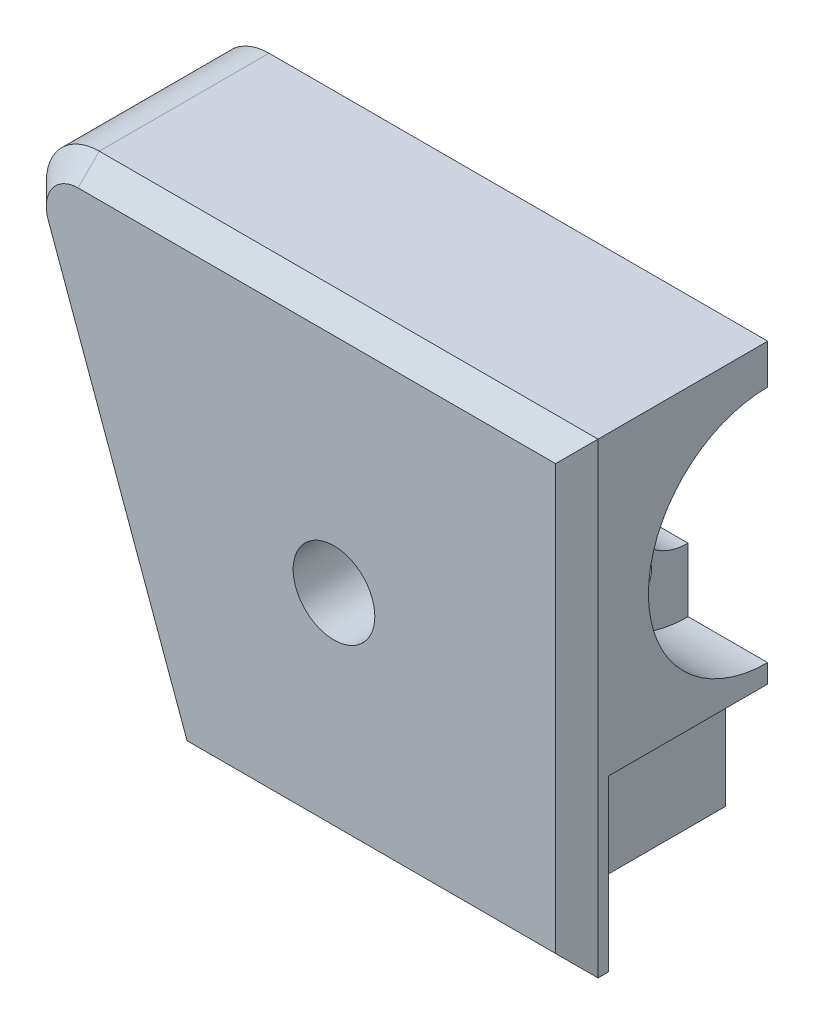
ISO-10303-21;
HEADER;
FILE_DESCRIPTION(('STEP AP214'),'2;1');
FILE_NAME('part.step','',(''),(''),'','','');
FILE_SCHEMA(('AUTOMOTIVE_DESIGN { 1 0 10303 214 1 1 1 1 }'));
ENDSEC;
DATA;
#1=APPLICATION_CONTEXT('core data for automotive mechanical design processes');
#2=APPLICATION_PROTOCOL_DEFINITION('international standard','automotive_design',2000,#1);
#3=PRODUCT_CONTEXT('',#1,'mechanical');
#4=PRODUCT('Part','Part','',(#3));
#5=PRODUCT_RELATED_PRODUCT_CATEGORY('part','',(#4));
#6=PRODUCT_DEFINITION_FORMATION('','',#4);
#7=PRODUCT_DEFINITION_CONTEXT('part definition',#1,'design');
#8=PRODUCT_DEFINITION('design','',#6,#7);
#9=PRODUCT_DEFINITION_SHAPE('','',#8);
#10=(LENGTH_UNIT() NAMED_UNIT(*) SI_UNIT(.MILLI.,.METRE.));
#11=(NAMED_UNIT(*) PLANE_ANGLE_UNIT() SI_UNIT($,.RADIAN.));
#12=(NAMED_UNIT(*) SI_UNIT($,.STERADIAN.) SOLID_ANGLE_UNIT());
#13=UNCERTAINTY_MEASURE_WITH_UNIT(LENGTH_MEASURE(1.E-05),#10,'distance_accuracy_value','');
#14=(GEOMETRIC_REPRESENTATION_CONTEXT(3) GLOBAL_UNCERTAINTY_ASSIGNED_CONTEXT((#13)) GLOBAL_UNIT_ASSIGNED_CONTEXT((#10,
#11,#12)) REPRESENTATION_CONTEXT('',''));
#15=CARTESIAN_POINT('',(0.,0.,0.));
#16=DIRECTION('',(0.,0.,1.));
#17=DIRECTION('',(1.,0.,0.));
#18=AXIS2_PLACEMENT_3D('',#15,#16,#17);
#19=CARTESIAN_POINT('',(11.1054228558984,9.,18.));
#20=DIRECTION('',(0.,0.,-1.));
#21=DIRECTION('',(-1.,0.,0.));
#22=AXIS2_PLACEMENT_3D('',#19,#20,#21);
#23=CYLINDRICAL_SURFACE('',#22,2.1);
#24=CARTESIAN_POINT('',(11.1054228558984,9.,0.));
#25=DIRECTION('',(0.,0.,-1.));
#26=DIRECTION('',(-1.,0.,0.));
#27=AXIS2_PLACEMENT_3D('',#24,#25,#26);
#28=CIRCLE('',#27,2.1);
#29=CARTESIAN_POINT('',(9.00542285589842,9.,0.));
#30=VERTEX_POINT('',#29);
#31=EDGE_CURVE('E277',#30,#30,#28,.T.);
#32=ORIENTED_EDGE('',*,*,#31,.T.);
#33=EDGE_LOOP('',(#32));
#34=FACE_BOUND('',#33,.T.);
#35=CARTESIAN_POINT('',(11.1054228558984,9.,10.));
#36=DIRECTION('',(0.,0.,1.));
#37=DIRECTION('',(1.,0.,0.));
#38=AXIS2_PLACEMENT_3D('',#35,#36,#37);
#39=CIRCLE('',#38,2.1);
#40=CARTESIAN_POINT('',(13.2054228558984,9.,10.));
#41=VERTEX_POINT('',#40);
#42=EDGE_CURVE('E46',#41,#41,#39,.F.);
#43=ORIENTED_EDGE('',*,*,#42,.F.);
#44=EDGE_LOOP('',(#43));
#45=FACE_BOUND('',#44,.T.);
#46=ADVANCED_FACE('F41',(#34,#45),#23,.F.);
#47=CARTESIAN_POINT('',(-11.425184053937,8.,18.));
#48=DIRECTION('',(0.939692620785907,0.342020143325672,0.));
#49=DIRECTION('',(-0.342020143325672,0.939692620785907,0.));
#50=AXIS2_PLACEMENT_3D('',#47,#48,#49);
#51=PLANE('',#50);
#52=DIRECTION('',(0.,0.,-1.));
#53=VECTOR('',#52,1.);
#54=CARTESIAN_POINT('',(-4.14577936861283,-12.,18.));
#55=LINE('',#54,#53);
#56=CARTESIAN_POINT('',(-4.14577936861283,-12.,16.));
#57=VERTEX_POINT('',#56);
#58=CARTESIAN_POINT('',(-4.14577936861283,-12.,0.));
#59=VERTEX_POINT('',#58);
#60=EDGE_CURVE('E326',#57,#59,#55,.T.);
#61=ORIENTED_EDGE('',*,*,#60,.F.);
#62=DIRECTION('',(-0.342020143325672,0.939692620785907,0.));
#63=VECTOR('',#62,1.);
#64=CARTESIAN_POINT('',(-11.425184053937,8.,16.));
#65=LINE('',#64,#63);
#66=CARTESIAN_POINT('',(-17.7181927465449,25.2898992833716,16.));
#67=VERTEX_POINT('',#66);
#68=EDGE_CURVE('E66',#57,#67,#65,.T.);
#69=ORIENTED_EDGE('',*,*,#68,.T.);
#70=DIRECTION('',(0.,0.,-1.));
#71=VECTOR('',#70,1.);
#72=CARTESIAN_POINT('',(-17.7181927465449,25.2898992833716,0.));
#73=LINE('',#72,#71);
#74=CARTESIAN_POINT('',(-17.7181927465449,25.2898992833716,0.));
#75=VERTEX_POINT('',#74);
#76=EDGE_CURVE('E250',#67,#75,#73,.T.);
#77=ORIENTED_EDGE('',*,*,#76,.T.);
#78=DIRECTION('',(-0.342020143325672,0.939692620785907,0.));
#79=VECTOR('',#78,1.);
#80=CARTESIAN_POINT('',(-2.689898431548,-16.,0.));
#81=LINE('',#80,#79);
#82=CARTESIAN_POINT('',(-15.883819423698,20.25,0.));
#83=VERTEX_POINT('',#82);
#84=EDGE_CURVE('E343',#83,#75,#81,.T.);
#85=ORIENTED_EDGE('',*,*,#84,.F.);
#86=CARTESIAN_POINT('',(-14.7009161623328,17.,0.));
#87=DIRECTION('',(0.939692620785907,0.342020143325672,0.));
#88=DIRECTION('',(0.342020143325672,-0.939692620785907,0.));
#89=AXIS2_PLACEMENT_3D('',#86,#87,#88);
#90=ELLIPSE('',#89,3.45857776054672,3.25);
#91=CARTESIAN_POINT('',(-13.5180129009677,13.75,0.));
#92=VERTEX_POINT('',#91);
#93=EDGE_CURVE('E316',#92,#83,#90,.F.);
#94=ORIENTED_EDGE('',*,*,#93,.F.);
#95=EDGE_CURVE('E344',#59,#92,#81,.T.);
#96=ORIENTED_EDGE('',*,*,#95,.F.);
#97=EDGE_LOOP('',(#61,#69,#77,#85,#94,#96));
#98=FACE_BOUND('',#97,.T.);
#99=ADVANCED_FACE('F416',(#98),#51,.F.);
#100=CARTESIAN_POINT('',(0.,0.,0.));
#101=DIRECTION('',(0.,0.,-1.));
#102=DIRECTION('',(-1.,0.,0.));
#103=AXIS2_PLACEMENT_3D('',#100,#101,#102);
#104=PLANE('',#103);
#105=ORIENTED_EDGE('',*,*,#84,.T.);
#106=CARTESIAN_POINT('',(-13.0197296426153,27.,0.));
#107=DIRECTION('',(0.,0.,-1.));
#108=DIRECTION('',(-1.,0.,0.));
#109=AXIS2_PLACEMENT_3D('',#106,#107,#108);
#110=CIRCLE('',#109,5.);
#111=CARTESIAN_POINT('',(-13.0197296426153,32.,0.));
#112=VERTEX_POINT('',#111);
#113=EDGE_CURVE('E252',#75,#112,#110,.T.);
#114=ORIENTED_EDGE('',*,*,#113,.T.);
#115=DIRECTION('',(1.,0.,0.));
#116=VECTOR('',#115,1.);
#117=CARTESIAN_POINT('',(-20.1604696763259,32.,0.));
#118=LINE('',#117,#116);
#119=CARTESIAN_POINT('',(34.,32.,0.));
#120=VERTEX_POINT('',#119);
#121=EDGE_CURVE('E318',#112,#120,#118,.T.);
#122=ORIENTED_EDGE('',*,*,#121,.T.);
#123=DIRECTION('',(0.,1.,0.));
#124=VECTOR('',#123,1.);
#125=CARTESIAN_POINT('',(34.,0.,0.));
#126=LINE('',#125,#124);
#127=CARTESIAN_POINT('',(34.,28.25,0.));
#128=VERTEX_POINT('',#127);
#129=EDGE_CURVE('E219',#128,#120,#126,.T.);
#130=ORIENTED_EDGE('',*,*,#129,.F.);
#131=DIRECTION('',(1.,0.,0.));
#132=VECTOR('',#131,1.);
#133=CARTESIAN_POINT('',(34.,28.25,0.));
#134=LINE('',#133,#132);
#135=CARTESIAN_POINT('',(26.5,28.25,0.));
#136=VERTEX_POINT('',#135);
#137=EDGE_CURVE('E196',#128,#136,#134,.F.);
#138=ORIENTED_EDGE('',*,*,#137,.T.);
#139=DIRECTION('',(0.,-1.,0.));
#140=VECTOR('',#139,1.);
#141=CARTESIAN_POINT('',(26.5,0.,0.));
#142=LINE('',#141,#140);
#143=CARTESIAN_POINT('',(26.5,22.25,0.));
#144=VERTEX_POINT('',#143);
#145=EDGE_CURVE('E244',#136,#144,#142,.T.);
#146=ORIENTED_EDGE('',*,*,#145,.T.);
#147=DIRECTION('',(1.,0.,0.));
#148=VECTOR('',#147,1.);
#149=CARTESIAN_POINT('',(34.,22.25,0.));
#150=LINE('',#149,#148);
#151=CARTESIAN_POINT('',(15.,22.25,0.));
#152=VERTEX_POINT('',#151);
#153=EDGE_CURVE('E247',#144,#152,#150,.F.);
#154=ORIENTED_EDGE('',*,*,#153,.T.);
#155=DIRECTION('',(0.,-1.,0.));
#156=VECTOR('',#155,1.);
#157=CARTESIAN_POINT('',(15.,0.,0.));
#158=LINE('',#157,#156);
#159=CARTESIAN_POINT('',(15.,20.25,0.));
#160=VERTEX_POINT('',#159);
#161=EDGE_CURVE('E240',#152,#160,#158,.T.);
#162=ORIENTED_EDGE('',*,*,#161,.T.);
#163=DIRECTION('',(1.,0.,0.));
#164=VECTOR('',#163,1.);
#165=CARTESIAN_POINT('',(34.,20.25,0.));
#166=LINE('',#165,#164);
#167=EDGE_CURVE('E243',#160,#83,#166,.F.);
#168=ORIENTED_EDGE('',*,*,#167,.T.);
#169=EDGE_LOOP('',(#105,#114,#122,#130,#138,#146,#154,#162,#168));
#170=FACE_BOUND('',#169,.T.);
#171=ADVANCED_FACE('F422',(#170),#104,.T.);
#172=ORIENTED_EDGE('',*,*,#31,.F.);
#173=EDGE_LOOP('',(#172));
#174=FACE_BOUND('',#173,.T.);
#175=CARTESIAN_POINT('',(26.5,11.75,0.));
#176=VERTEX_POINT('',#175);
#177=CARTESIAN_POINT('',(26.5,5.75,0.));
#178=VERTEX_POINT('',#177);
#179=EDGE_CURVE('E211',#176,#178,#142,.T.);
#180=ORIENTED_EDGE('',*,*,#179,.T.);
#181=DIRECTION('',(1.,0.,0.));
#182=VECTOR('',#181,1.);
#183=CARTESIAN_POINT('',(34.,5.75,0.));
#184=LINE('',#183,#182);
#185=CARTESIAN_POINT('',(34.,5.75,0.));
#186=VERTEX_POINT('',#185);
#187=EDGE_CURVE('E193',#178,#186,#184,.T.);
#188=ORIENTED_EDGE('',*,*,#187,.T.);
#189=CARTESIAN_POINT('',(34.,4.,0.));
#190=VERTEX_POINT('',#189);
#191=EDGE_CURVE('E208',#190,#186,#126,.T.);
#192=ORIENTED_EDGE('',*,*,#191,.F.);
#193=DIRECTION('',(-1.,0.,0.));
#194=VECTOR('',#193,1.);
#195=CARTESIAN_POINT('',(-5.71259202696848,4.,0.));
#196=LINE('',#195,#194);
#197=CARTESIAN_POINT('',(-2.85629601348424,4.,0.));
#198=VERTEX_POINT('',#197);
#199=EDGE_CURVE('E347',#190,#198,#196,.T.);
#200=ORIENTED_EDGE('',*,*,#199,.T.);
#201=CARTESIAN_POINT('',(-2.85629601348424,2.,0.));
#202=DIRECTION('',(0.,0.,-1.));
#203=DIRECTION('',(-1.,0.,0.));
#204=AXIS2_PLACEMENT_3D('',#201,#202,#203);
#205=CIRCLE('',#204,2.);
#206=CARTESIAN_POINT('',(-4.73568125505605,1.31595971334866,0.));
#207=VERTEX_POINT('',#206);
#208=EDGE_CURVE('E231',#198,#207,#205,.F.);
#209=ORIENTED_EDGE('',*,*,#208,.T.);
#210=DIRECTION('',(0.342020143325672,-0.939692620785907,0.));
#211=VECTOR('',#210,1.);
#212=CARTESIAN_POINT('',(0.110931721290824,-12.,0.));
#213=LINE('',#212,#211);
#214=CARTESIAN_POINT('',(0.110931721290827,-12.,0.));
#215=VERTEX_POINT('',#214);
#216=EDGE_CURVE('E335',#207,#215,#213,.T.);
#217=ORIENTED_EDGE('',*,*,#216,.T.);
#218=DIRECTION('',(1.,0.,0.));
#219=VECTOR('',#218,1.);
#220=CARTESIAN_POINT('',(34.,-12.,0.));
#221=LINE('',#220,#219);
#222=EDGE_CURVE('E323',#59,#215,#221,.T.);
#223=ORIENTED_EDGE('',*,*,#222,.F.);
#224=ORIENTED_EDGE('',*,*,#95,.T.);
#225=DIRECTION('',(1.,0.,0.));
#226=VECTOR('',#225,1.);
#227=CARTESIAN_POINT('',(34.,13.75,0.));
#228=LINE('',#227,#226);
#229=CARTESIAN_POINT('',(15.,13.75,0.));
#230=VERTEX_POINT('',#229);
#231=EDGE_CURVE('E233',#92,#230,#228,.T.);
#232=ORIENTED_EDGE('',*,*,#231,.T.);
#233=CARTESIAN_POINT('',(15.,11.75,0.));
#234=VERTEX_POINT('',#233);
#235=EDGE_CURVE('E236',#230,#234,#158,.T.);
#236=ORIENTED_EDGE('',*,*,#235,.T.);
#237=DIRECTION('',(1.,0.,0.));
#238=VECTOR('',#237,1.);
#239=CARTESIAN_POINT('',(34.,11.75,0.));
#240=LINE('',#239,#238);
#241=EDGE_CURVE('E239',#234,#176,#240,.T.);
#242=ORIENTED_EDGE('',*,*,#241,.T.);
#243=EDGE_LOOP('',(#180,#188,#192,#200,#209,#217,#223,#224,#232,#236,#242));
#244=FACE_BOUND('',#243,.T.);
#245=ADVANCED_FACE('F206',(#174,#244),#104,.T.);
#246=CARTESIAN_POINT('',(2.91176187412966,-8.00000000000001,15.));
#247=DIRECTION('',(0.939692620785907,0.342020143325672,0.));
#248=DIRECTION('',(-0.342020143325672,0.939692620785907,0.));
#249=AXIS2_PLACEMENT_3D('',#246,#247,#248);
#250=PLANE('',#249);
#251=DIRECTION('',(0.342020143325672,-0.939692620785907,0.));
#252=VECTOR('',#251,1.);
#253=CARTESIAN_POINT('',(2.91176187412966,-8.00000000000001,0.));
#254=LINE('',#253,#252);
#255=CARTESIAN_POINT('',(0.,0.,0.));
#256=VERTEX_POINT('',#255);
#257=CARTESIAN_POINT('',(2.91176187412966,-8.00000000000001,0.));
#258=VERTEX_POINT('',#257);
#259=EDGE_CURVE('E352',#256,#258,#254,.T.);
#260=ORIENTED_EDGE('',*,*,#259,.T.);
#261=DIRECTION('',(0.,0.,-1.));
#262=VECTOR('',#261,1.);
#263=CARTESIAN_POINT('',(2.91176187412966,-8.00000000000001,15.));
#264=LINE('',#263,#262);
#265=CARTESIAN_POINT('',(2.91176187412966,-8.00000000000001,15.));
#266=VERTEX_POINT('',#265);
#267=EDGE_CURVE('E224',#266,#258,#264,.T.);
#268=ORIENTED_EDGE('',*,*,#267,.F.);
#269=DIRECTION('',(0.342020143325672,-0.939692620785907,0.));
#270=VECTOR('',#269,1.);
#271=CARTESIAN_POINT('',(2.91176187412966,-8.00000000000001,15.));
#272=LINE('',#271,#270);
#273=CARTESIAN_POINT('',(0.,0.,15.));
#274=VERTEX_POINT('',#273);
#275=EDGE_CURVE('E353',#274,#266,#272,.T.);
#276=ORIENTED_EDGE('',*,*,#275,.F.);
#277=DIRECTION('',(0.,0.,-1.));
#278=VECTOR('',#277,1.);
#279=CARTESIAN_POINT('',(0.,0.,15.));
#280=LINE('',#279,#278);
#281=EDGE_CURVE('E366',#274,#256,#280,.T.);
#282=ORIENTED_EDGE('',*,*,#281,.T.);
#283=EDGE_LOOP('',(#260,#268,#276,#282));
#284=FACE_BOUND('',#283,.T.);
#285=ADVANCED_FACE('F389',(#284),#250,.F.);
#286=CARTESIAN_POINT('',(30.,-8.,15.));
#287=DIRECTION('',(0.,1.,0.));
#288=DIRECTION('',(-1.,0.,0.));
#289=AXIS2_PLACEMENT_3D('',#286,#287,#288);
#290=PLANE('',#289);
#291=DIRECTION('',(1.,0.,0.));
#292=VECTOR('',#291,1.);
#293=CARTESIAN_POINT('',(30.,-8.,0.));
#294=LINE('',#293,#292);
#295=CARTESIAN_POINT('',(30.,-8.,0.));
#296=VERTEX_POINT('',#295);
#297=EDGE_CURVE('E369',#258,#296,#294,.T.);
#298=ORIENTED_EDGE('',*,*,#297,.T.);
#299=DIRECTION('',(0.,0.,-1.));
#300=VECTOR('',#299,1.);
#301=CARTESIAN_POINT('',(30.,-8.,15.));
#302=LINE('',#301,#300);
#303=CARTESIAN_POINT('',(30.,-8.,15.));
#304=VERTEX_POINT('',#303);
#305=EDGE_CURVE('E378',#304,#296,#302,.T.);
#306=ORIENTED_EDGE('',*,*,#305,.F.);
#307=DIRECTION('',(1.,0.,0.));
#308=VECTOR('',#307,1.);
#309=CARTESIAN_POINT('',(30.,-8.,15.));
#310=LINE('',#309,#308);
#311=EDGE_CURVE('E356',#266,#304,#310,.T.);
#312=ORIENTED_EDGE('',*,*,#311,.F.);
#313=ORIENTED_EDGE('',*,*,#267,.T.);
#314=EDGE_LOOP('',(#298,#306,#312,#313));
#315=FACE_BOUND('',#314,.T.);
#316=ADVANCED_FACE('F386',(#315),#290,.F.);
#317=CARTESIAN_POINT('',(30.,0.,15.));
#318=DIRECTION('',(-1.,0.,0.));
#319=DIRECTION('',(0.,0.,1.));
#320=AXIS2_PLACEMENT_3D('',#317,#318,#319);
#321=PLANE('',#320);
#322=DIRECTION('',(0.,1.,0.));
#323=VECTOR('',#322,1.);
#324=CARTESIAN_POINT('',(30.,0.,0.));
#325=LINE('',#324,#323);
#326=CARTESIAN_POINT('',(30.,0.,0.));
#327=VERTEX_POINT('',#326);
#328=EDGE_CURVE('E371',#296,#327,#325,.T.);
#329=ORIENTED_EDGE('',*,*,#328,.T.);
#330=DIRECTION('',(0.,0.,-1.));
#331=VECTOR('',#330,1.);
#332=CARTESIAN_POINT('',(30.,0.,15.));
#333=LINE('',#332,#331);
#334=CARTESIAN_POINT('',(30.,0.,15.));
#335=VERTEX_POINT('',#334);
#336=EDGE_CURVE('E376',#335,#327,#333,.T.);
#337=ORIENTED_EDGE('',*,*,#336,.F.);
#338=DIRECTION('',(0.,1.,0.));
#339=VECTOR('',#338,1.);
#340=CARTESIAN_POINT('',(30.,0.,15.));
#341=LINE('',#340,#339);
#342=EDGE_CURVE('E360',#304,#335,#341,.T.);
#343=ORIENTED_EDGE('',*,*,#342,.F.);
#344=ORIENTED_EDGE('',*,*,#305,.T.);
#345=EDGE_LOOP('',(#329,#337,#343,#344));
#346=FACE_BOUND('',#345,.T.);
#347=ADVANCED_FACE('F394',(#346),#321,.F.);
#348=CARTESIAN_POINT('',(0.,0.,15.));
#349=DIRECTION('',(0.,-1.,0.));
#350=DIRECTION('',(0.,0.,-1.));
#351=AXIS2_PLACEMENT_3D('',#348,#349,#350);
#352=PLANE('',#351);
#353=DIRECTION('',(-1.,0.,0.));
#354=VECTOR('',#353,1.);
#355=CARTESIAN_POINT('',(0.,0.,0.));
#356=LINE('',#355,#354);
#357=EDGE_CURVE('E357',#327,#256,#356,.T.);
#358=ORIENTED_EDGE('',*,*,#357,.T.);
#359=ORIENTED_EDGE('',*,*,#281,.F.);
#360=DIRECTION('',(-1.,0.,0.));
#361=VECTOR('',#360,1.);
#362=CARTESIAN_POINT('',(0.,0.,15.));
#363=LINE('',#362,#361);
#364=EDGE_CURVE('E363',#335,#274,#363,.T.);
#365=ORIENTED_EDGE('',*,*,#364,.F.);
#366=ORIENTED_EDGE('',*,*,#336,.T.);
#367=EDGE_LOOP('',(#358,#359,#365,#366));
#368=FACE_BOUND('',#367,.T.);
#369=ADVANCED_FACE('F397',(#368),#352,.F.);
#370=CARTESIAN_POINT('',(0.,0.,0.));
#371=DIRECTION('',(0.,0.,-1.));
#372=DIRECTION('',(-1.,0.,0.));
#373=AXIS2_PLACEMENT_3D('',#370,#371,#372);
#374=PLANE('',#373);
#375=ORIENTED_EDGE('',*,*,#259,.F.);
#376=ORIENTED_EDGE('',*,*,#357,.F.);
#377=ORIENTED_EDGE('',*,*,#328,.F.);
#378=ORIENTED_EDGE('',*,*,#297,.F.);
#379=EDGE_LOOP('',(#375,#376,#377,#378));
#380=FACE_BOUND('',#379,.T.);
#381=ADVANCED_FACE('F393',(#380),#374,.T.);
#382=CARTESIAN_POINT('',(0.,0.,18.));
#383=DIRECTION('',(0.,0.,-1.));
#384=DIRECTION('',(-1.,0.,0.));
#385=AXIS2_PLACEMENT_3D('',#382,#383,#384);
#386=PLANE('',#385);
#387=CARTESIAN_POINT('',(11.1054228558984,9.,18.));
#388=DIRECTION('',(0.,0.,1.));
#389=DIRECTION('',(1.,0.,0.));
#390=AXIS2_PLACEMENT_3D('',#387,#388,#389);
#391=CIRCLE('',#390,3.85);
#392=CARTESIAN_POINT('',(14.9554228558984,9.,18.));
#393=VERTEX_POINT('',#392);
#394=EDGE_CURVE('E602',#393,#393,#391,.T.);
#395=ORIENTED_EDGE('',*,*,#394,.F.);
#396=EDGE_LOOP('',(#395));
#397=FACE_BOUND('',#396,.T.);
#398=DIRECTION('',(1.,0.,0.));
#399=VECTOR('',#398,1.);
#400=CARTESIAN_POINT('',(0.,-10.,18.));
#401=LINE('',#400,#399);
#402=CARTESIAN_POINT('',(-2.74536429219341,-10.,18.));
#403=VERTEX_POINT('',#402);
#404=CARTESIAN_POINT('',(32.,-10.,18.));
#405=VERTEX_POINT('',#404);
#406=EDGE_CURVE('E262',#403,#405,#401,.T.);
#407=ORIENTED_EDGE('',*,*,#406,.T.);
#408=DIRECTION('',(0.,1.,0.));
#409=VECTOR('',#408,1.);
#410=CARTESIAN_POINT('',(32.,0.,18.));
#411=LINE('',#410,#409);
#412=CARTESIAN_POINT('',(32.,30.,18.));
#413=VERTEX_POINT('',#412);
#414=EDGE_CURVE('E264',#405,#413,#411,.T.);
#415=ORIENTED_EDGE('',*,*,#414,.T.);
#416=DIRECTION('',(-1.,0.,0.));
#417=VECTOR('',#416,1.);
#418=CARTESIAN_POINT('',(-13.0197296426153,30.,18.));
#419=LINE('',#418,#417);
#420=CARTESIAN_POINT('',(-13.0197296426153,30.,18.));
#421=VERTEX_POINT('',#420);
#422=EDGE_CURVE('E256',#413,#421,#419,.T.);
#423=ORIENTED_EDGE('',*,*,#422,.T.);
#424=CARTESIAN_POINT('',(-13.0197296426153,27.,18.));
#425=DIRECTION('',(0.,0.,-1.));
#426=DIRECTION('',(-1.,0.,0.));
#427=AXIS2_PLACEMENT_3D('',#424,#425,#426);
#428=CIRCLE('',#427,3.);
#429=CARTESIAN_POINT('',(-15.838807504973,25.973939570023,18.));
#430=VERTEX_POINT('',#429);
#431=EDGE_CURVE('E258',#421,#430,#428,.F.);
#432=ORIENTED_EDGE('',*,*,#431,.T.);
#433=DIRECTION('',(0.342020143325672,-0.939692620785907,0.));
#434=VECTOR('',#433,1.);
#435=CARTESIAN_POINT('',(-5.63815572471544,-2.05212085995403,18.));
#436=LINE('',#435,#434);
#437=EDGE_CURVE('E260',#430,#403,#436,.T.);
#438=ORIENTED_EDGE('',*,*,#437,.T.);
#439=EDGE_LOOP('',(#407,#415,#423,#432,#438));
#440=FACE_BOUND('',#439,.T.);
#441=ADVANCED_FACE('F402',(#397,#440),#386,.F.);
#442=CARTESIAN_POINT('',(0.,0.,15.));
#443=DIRECTION('',(0.,0.,-1.));
#444=DIRECTION('',(-1.,0.,0.));
#445=AXIS2_PLACEMENT_3D('',#442,#443,#444);
#446=PLANE('',#445);
#447=DIRECTION('',(-0.342020143325672,0.939692620785907,0.));
#448=VECTOR('',#447,1.);
#449=CARTESIAN_POINT('',(0.110931721290824,-12.,15.));
#450=LINE('',#449,#448);
#451=CARTESIAN_POINT('',(0.110931721290824,-12.,15.));
#452=VERTEX_POINT('',#451);
#453=CARTESIAN_POINT('',(-4.73568125505605,1.31595971334866,15.));
#454=VERTEX_POINT('',#453);
#455=EDGE_CURVE('E341',#452,#454,#450,.T.);
#456=ORIENTED_EDGE('',*,*,#455,.T.);
#457=CARTESIAN_POINT('',(-2.85629601348424,2.,15.));
#458=DIRECTION('',(0.,0.,-1.));
#459=DIRECTION('',(-1.,0.,0.));
#460=AXIS2_PLACEMENT_3D('',#457,#458,#459);
#461=CIRCLE('',#460,2.);
#462=CARTESIAN_POINT('',(-2.85629601348424,4.,15.));
#463=VERTEX_POINT('',#462);
#464=EDGE_CURVE('E229',#454,#463,#461,.T.);
#465=ORIENTED_EDGE('',*,*,#464,.T.);
#466=DIRECTION('',(1.,0.,0.));
#467=VECTOR('',#466,1.);
#468=CARTESIAN_POINT('',(-5.71259202696848,4.,15.));
#469=LINE('',#468,#467);
#470=CARTESIAN_POINT('',(34.,4.,15.));
#471=VERTEX_POINT('',#470);
#472=EDGE_CURVE('E339',#463,#471,#469,.T.);
#473=ORIENTED_EDGE('',*,*,#472,.T.);
#474=DIRECTION('',(0.,-1.,0.));
#475=VECTOR('',#474,1.);
#476=CARTESIAN_POINT('',(34.,4.,15.));
#477=LINE('',#476,#475);
#478=CARTESIAN_POINT('',(34.,-12.,15.));
#479=VERTEX_POINT('',#478);
#480=EDGE_CURVE('E336',#471,#479,#477,.T.);
#481=ORIENTED_EDGE('',*,*,#480,.T.);
#482=DIRECTION('',(1.,0.,0.));
#483=VECTOR('',#482,1.);
#484=CARTESIAN_POINT('',(0.,-12.,15.));
#485=LINE('',#484,#483);
#486=EDGE_CURVE('E332',#452,#479,#485,.T.);
#487=ORIENTED_EDGE('',*,*,#486,.F.);
#488=EDGE_LOOP('',(#456,#465,#473,#481,#487));
#489=FACE_BOUND('',#488,.T.);
#490=ORIENTED_EDGE('',*,*,#364,.T.);
#491=ORIENTED_EDGE('',*,*,#275,.T.);
#492=ORIENTED_EDGE('',*,*,#311,.T.);
#493=ORIENTED_EDGE('',*,*,#342,.T.);
#494=EDGE_LOOP('',(#490,#491,#492,#493));
#495=FACE_BOUND('',#494,.T.);
#496=ADVANCED_FACE('F399',(#489,#495),#446,.T.);
#497=CARTESIAN_POINT('',(-5.71259202696848,4.,69.944051714135));
#498=DIRECTION('',(0.,-1.,0.));
#499=DIRECTION('',(0.,0.,-1.));
#500=AXIS2_PLACEMENT_3D('',#497,#498,#499);
#501=PLANE('',#500);
#502=ORIENTED_EDGE('',*,*,#472,.F.);
#503=DIRECTION('',(0.,0.,-1.));
#504=VECTOR('',#503,1.);
#505=CARTESIAN_POINT('',(-2.85629601348424,4.,0.));
#506=LINE('',#505,#504);
#507=EDGE_CURVE('E218',#463,#198,#506,.T.);
#508=ORIENTED_EDGE('',*,*,#507,.T.);
#509=ORIENTED_EDGE('',*,*,#199,.F.);
#510=DIRECTION('',(0.,0.,-1.));
#511=VECTOR('',#510,1.);
#512=CARTESIAN_POINT('',(34.,4.,69.944051714135));
#513=LINE('',#512,#511);
#514=EDGE_CURVE('E217',#471,#190,#513,.T.);
#515=ORIENTED_EDGE('',*,*,#514,.F.);
#516=EDGE_LOOP('',(#502,#508,#509,#515));
#517=FACE_BOUND('',#516,.T.);
#518=ADVANCED_FACE('F401',(#517),#501,.T.);
#519=CARTESIAN_POINT('',(0.110931721290824,-12.,69.944051714135));
#520=DIRECTION('',(0.939692620785907,0.342020143325672,0.));
#521=DIRECTION('',(-0.342020143325672,0.939692620785907,0.));
#522=AXIS2_PLACEMENT_3D('',#519,#520,#521);
#523=PLANE('',#522);
#524=ORIENTED_EDGE('',*,*,#216,.F.);
#525=DIRECTION('',(0.,0.,-1.));
#526=VECTOR('',#525,1.);
#527=CARTESIAN_POINT('',(-4.73568125505605,1.31595971334866,15.));
#528=LINE('',#527,#526);
#529=EDGE_CURVE('E222',#207,#454,#528,.F.);
#530=ORIENTED_EDGE('',*,*,#529,.T.);
#531=ORIENTED_EDGE('',*,*,#455,.F.);
#532=DIRECTION('',(0.,0.,1.));
#533=VECTOR('',#532,1.);
#534=CARTESIAN_POINT('',(0.110931721290824,-12.,69.944051714135));
#535=LINE('',#534,#533);
#536=EDGE_CURVE('E329',#215,#452,#535,.T.);
#537=ORIENTED_EDGE('',*,*,#536,.F.);
#538=EDGE_LOOP('',(#524,#530,#531,#537));
#539=FACE_BOUND('',#538,.T.);
#540=ADVANCED_FACE('F409',(#539),#523,.T.);
#541=CARTESIAN_POINT('',(34.,8.,18.));
#542=DIRECTION('',(-1.,0.,0.));
#543=DIRECTION('',(0.,0.,1.));
#544=AXIS2_PLACEMENT_3D('',#541,#542,#543);
#545=PLANE('',#544);
#546=DIRECTION('',(0.,0.,-1.));
#547=VECTOR('',#546,1.);
#548=CARTESIAN_POINT('',(34.,32.,77.239821704325));
#549=LINE('',#548,#547);
#550=CARTESIAN_POINT('',(34.,32.,16.));
#551=VERTEX_POINT('',#550);
#552=EDGE_CURVE('E321',#551,#120,#549,.T.);
#553=ORIENTED_EDGE('',*,*,#552,.F.);
#554=DIRECTION('',(0.,-1.,0.));
#555=VECTOR('',#554,1.);
#556=CARTESIAN_POINT('',(34.,8.,16.));
#557=LINE('',#556,#555);
#558=CARTESIAN_POINT('',(34.,-12.,16.));
#559=VERTEX_POINT('',#558);
#560=EDGE_CURVE('E267',#551,#559,#557,.T.);
#561=ORIENTED_EDGE('',*,*,#560,.T.);
#562=DIRECTION('',(0.,0.,-1.));
#563=VECTOR('',#562,1.);
#564=CARTESIAN_POINT('',(34.,-12.,18.));
#565=LINE('',#564,#563);
#566=EDGE_CURVE('E327',#559,#479,#565,.T.);
#567=ORIENTED_EDGE('',*,*,#566,.T.);
#568=ORIENTED_EDGE('',*,*,#480,.F.);
#569=ORIENTED_EDGE('',*,*,#514,.T.);
#570=ORIENTED_EDGE('',*,*,#191,.T.);
#571=CARTESIAN_POINT('',(34.,17.,0.));
#572=DIRECTION('',(1.,0.,0.));
#573=DIRECTION('',(0.,0.,-1.));
#574=AXIS2_PLACEMENT_3D('',#571,#572,#573);
#575=CIRCLE('',#574,11.25);
#576=EDGE_CURVE('E189',#128,#186,#575,.T.);
#577=ORIENTED_EDGE('',*,*,#576,.F.);
#578=ORIENTED_EDGE('',*,*,#129,.T.);
#579=EDGE_LOOP('',(#553,#561,#567,#568,#569,#570,#577,#578));
#580=FACE_BOUND('',#579,.T.);
#581=ADVANCED_FACE('F214',(#580),#545,.F.);
#582=CARTESIAN_POINT('',(34.,-12.,18.));
#583=DIRECTION('',(0.,1.,0.));
#584=DIRECTION('',(0.,0.,1.));
#585=AXIS2_PLACEMENT_3D('',#582,#583,#584);
#586=PLANE('',#585);
#587=ORIENTED_EDGE('',*,*,#566,.F.);
#588=DIRECTION('',(-1.,0.,0.));
#589=VECTOR('',#588,1.);
#590=CARTESIAN_POINT('',(34.,-12.,16.));
#591=LINE('',#590,#589);
#592=EDGE_CURVE('E270',#559,#57,#591,.T.);
#593=ORIENTED_EDGE('',*,*,#592,.T.);
#594=ORIENTED_EDGE('',*,*,#60,.T.);
#595=ORIENTED_EDGE('',*,*,#222,.T.);
#596=ORIENTED_EDGE('',*,*,#536,.T.);
#597=ORIENTED_EDGE('',*,*,#486,.T.);
#598=EDGE_LOOP('',(#587,#593,#594,#595,#596,#597));
#599=FACE_BOUND('',#598,.T.);
#600=ADVANCED_FACE('F471',(#599),#586,.F.);
#601=CARTESIAN_POINT('',(-2.85629601348424,2.,69.944051714135));
#602=DIRECTION('',(0.,0.,1.));
#603=DIRECTION('',(1.,0.,0.));
#604=AXIS2_PLACEMENT_3D('',#601,#602,#603);
#605=CYLINDRICAL_SURFACE('',#604,2.);
#606=ORIENTED_EDGE('',*,*,#464,.F.);
#607=ORIENTED_EDGE('',*,*,#529,.F.);
#608=ORIENTED_EDGE('',*,*,#208,.F.);
#609=ORIENTED_EDGE('',*,*,#507,.F.);
#610=EDGE_LOOP('',(#606,#607,#608,#609));
#611=FACE_BOUND('',#610,.T.);
#612=ADVANCED_FACE('F467',(#611),#605,.F.);
#613=CARTESIAN_POINT('',(-20.1604696763259,32.,77.239821704325));
#614=DIRECTION('',(0.,1.,0.));
#615=DIRECTION('',(-1.,0.,0.));
#616=AXIS2_PLACEMENT_3D('',#613,#614,#615);
#617=PLANE('',#616);
#618=DIRECTION('',(0.,0.,-1.));
#619=VECTOR('',#618,1.);
#620=CARTESIAN_POINT('',(-13.0197296426153,32.,18.));
#621=LINE('',#620,#619);
#622=CARTESIAN_POINT('',(-13.0197296426153,32.,16.));
#623=VERTEX_POINT('',#622);
#624=EDGE_CURVE('E254',#112,#623,#621,.F.);
#625=ORIENTED_EDGE('',*,*,#624,.T.);
#626=DIRECTION('',(1.,0.,0.));
#627=VECTOR('',#626,1.);
#628=CARTESIAN_POINT('',(34.,32.,16.));
#629=LINE('',#628,#627);
#630=EDGE_CURVE('E13',#623,#551,#629,.T.);
#631=ORIENTED_EDGE('',*,*,#630,.T.);
#632=ORIENTED_EDGE('',*,*,#552,.T.);
#633=ORIENTED_EDGE('',*,*,#121,.F.);
#634=EDGE_LOOP('',(#625,#631,#632,#633));
#635=FACE_BOUND('',#634,.T.);
#636=ADVANCED_FACE('F464',(#635),#617,.T.);
#637=CARTESIAN_POINT('',(34.,17.,0.));
#638=DIRECTION('',(1.,0.,0.));
#639=DIRECTION('',(0.,0.,-1.));
#640=AXIS2_PLACEMENT_3D('',#637,#638,#639);
#641=CYLINDRICAL_SURFACE('',#640,11.25);
#642=ORIENTED_EDGE('',*,*,#576,.T.);
#643=ORIENTED_EDGE('',*,*,#187,.F.);
#644=CARTESIAN_POINT('',(26.5,17.,0.));
#645=DIRECTION('',(1.,0.,0.));
#646=DIRECTION('',(0.,0.,-1.));
#647=AXIS2_PLACEMENT_3D('',#644,#645,#646);
#648=CIRCLE('',#647,11.25);
#649=EDGE_CURVE('E201',#136,#178,#648,.T.);
#650=ORIENTED_EDGE('',*,*,#649,.F.);
#651=ORIENTED_EDGE('',*,*,#137,.F.);
#652=EDGE_LOOP('',(#642,#643,#650,#651));
#653=FACE_BOUND('',#652,.T.);
#654=ADVANCED_FACE('F191',(#653),#641,.F.);
#655=CARTESIAN_POINT('',(26.5,28.25,0.));
#656=DIRECTION('',(1.,0.,0.));
#657=DIRECTION('',(0.,0.,-1.));
#658=AXIS2_PLACEMENT_3D('',#655,#656,#657);
#659=PLANE('',#658);
#660=CARTESIAN_POINT('',(26.5,11.3431457505076,5.65685424949239));
#661=DIRECTION('',(1.,0.,0.));
#662=DIRECTION('',(0.,0.,-1.));
#663=AXIS2_PLACEMENT_3D('',#660,#661,#662);
#664=CIRCLE('',#663,2.2);
#665=CARTESIAN_POINT('',(26.5,11.3431457505076,3.45685424949239));
#666=VERTEX_POINT('',#665);
#667=EDGE_CURVE('E286',#666,#666,#664,.T.);
#668=ORIENTED_EDGE('',*,*,#667,.F.);
#669=EDGE_LOOP('',(#668));
#670=FACE_BOUND('',#669,.T.);
#671=CARTESIAN_POINT('',(26.5,22.6568542494924,5.65685424949237));
#672=DIRECTION('',(1.,0.,0.));
#673=DIRECTION('',(0.,0.,-1.));
#674=AXIS2_PLACEMENT_3D('',#671,#672,#673);
#675=CIRCLE('',#674,2.2);
#676=CARTESIAN_POINT('',(26.5,22.6568542494924,3.45685424949237));
#677=VERTEX_POINT('',#676);
#678=EDGE_CURVE('E296',#677,#677,#675,.T.);
#679=ORIENTED_EDGE('',*,*,#678,.F.);
#680=EDGE_LOOP('',(#679));
#681=FACE_BOUND('',#680,.T.);
#682=ORIENTED_EDGE('',*,*,#649,.T.);
#683=ORIENTED_EDGE('',*,*,#179,.F.);
#684=CARTESIAN_POINT('',(26.5,17.,0.));
#685=DIRECTION('',(1.,0.,0.));
#686=DIRECTION('',(0.,0.,-1.));
#687=AXIS2_PLACEMENT_3D('',#684,#685,#686);
#688=CIRCLE('',#687,5.25);
#689=EDGE_CURVE('E311',#144,#176,#688,.T.);
#690=ORIENTED_EDGE('',*,*,#689,.F.);
#691=ORIENTED_EDGE('',*,*,#145,.F.);
#692=EDGE_LOOP('',(#682,#683,#690,#691));
#693=FACE_BOUND('',#692,.T.);
#694=ADVANCED_FACE('F457',(#670,#681,#693),#659,.T.);
#695=CARTESIAN_POINT('',(34.,17.,0.));
#696=DIRECTION('',(1.,0.,0.));
#697=DIRECTION('',(0.,0.,-1.));
#698=AXIS2_PLACEMENT_3D('',#695,#696,#697);
#699=CYLINDRICAL_SURFACE('',#698,5.25);
#700=ORIENTED_EDGE('',*,*,#689,.T.);
#701=ORIENTED_EDGE('',*,*,#241,.F.);
#702=CARTESIAN_POINT('',(15.,17.,0.));
#703=DIRECTION('',(1.,0.,0.));
#704=DIRECTION('',(0.,0.,-1.));
#705=AXIS2_PLACEMENT_3D('',#702,#703,#704);
#706=CIRCLE('',#705,5.25);
#707=EDGE_CURVE('E308',#152,#234,#706,.T.);
#708=ORIENTED_EDGE('',*,*,#707,.F.);
#709=ORIENTED_EDGE('',*,*,#153,.F.);
#710=EDGE_LOOP('',(#700,#701,#708,#709));
#711=FACE_BOUND('',#710,.T.);
#712=ADVANCED_FACE('F453',(#711),#699,.F.);
#713=CARTESIAN_POINT('',(15.,22.25,0.));
#714=DIRECTION('',(1.,0.,0.));
#715=DIRECTION('',(0.,0.,-1.));
#716=AXIS2_PLACEMENT_3D('',#713,#714,#715);
#717=PLANE('',#716);
#718=ORIENTED_EDGE('',*,*,#707,.T.);
#719=ORIENTED_EDGE('',*,*,#235,.F.);
#720=CARTESIAN_POINT('',(15.,17.,0.));
#721=DIRECTION('',(1.,0.,0.));
#722=DIRECTION('',(0.,0.,-1.));
#723=AXIS2_PLACEMENT_3D('',#720,#721,#722);
#724=CIRCLE('',#723,3.25);
#725=EDGE_CURVE('E303',#160,#230,#724,.T.);
#726=ORIENTED_EDGE('',*,*,#725,.F.);
#727=ORIENTED_EDGE('',*,*,#161,.F.);
#728=EDGE_LOOP('',(#718,#719,#726,#727));
#729=FACE_BOUND('',#728,.T.);
#730=ADVANCED_FACE('F449',(#729),#717,.T.);
#731=CARTESIAN_POINT('',(34.,17.,0.));
#732=DIRECTION('',(1.,0.,0.));
#733=DIRECTION('',(0.,0.,-1.));
#734=AXIS2_PLACEMENT_3D('',#731,#732,#733);
#735=CYLINDRICAL_SURFACE('',#734,3.25);
#736=ORIENTED_EDGE('',*,*,#725,.T.);
#737=ORIENTED_EDGE('',*,*,#231,.F.);
#738=ORIENTED_EDGE('',*,*,#93,.T.);
#739=ORIENTED_EDGE('',*,*,#167,.F.);
#740=EDGE_LOOP('',(#736,#737,#738,#739));
#741=FACE_BOUND('',#740,.T.);
#742=ADVANCED_FACE('F445',(#741),#735,.F.);
#743=CARTESIAN_POINT('',(20.5,22.6568542494924,5.65685424949237));
#744=DIRECTION('',(1.,0.,0.));
#745=DIRECTION('',(0.,0.,-1.));
#746=AXIS2_PLACEMENT_3D('',#743,#744,#745);
#747=CYLINDRICAL_SURFACE('',#746,2.2);
#748=CARTESIAN_POINT('',(20.5,22.6568542494924,5.65685424949237));
#749=DIRECTION('',(1.,0.,0.));
#750=DIRECTION('',(0.,0.,-1.));
#751=AXIS2_PLACEMENT_3D('',#748,#749,#750);
#752=CIRCLE('',#751,2.2);
#753=CARTESIAN_POINT('',(20.5,22.6568542494924,3.45685424949237));
#754=VERTEX_POINT('',#753);
#755=EDGE_CURVE('E300',#754,#754,#752,.T.);
#756=ORIENTED_EDGE('',*,*,#755,.F.);
#757=EDGE_LOOP('',(#756));
#758=FACE_BOUND('',#757,.T.);
#759=ORIENTED_EDGE('',*,*,#678,.T.);
#760=EDGE_LOOP('',(#759));
#761=FACE_BOUND('',#760,.T.);
#762=ADVANCED_FACE('F441',(#758,#761),#747,.F.);
#763=CARTESIAN_POINT('',(20.5,22.6568542494924,5.65685424949237));
#764=DIRECTION('',(1.,0.,0.));
#765=DIRECTION('',(0.,0.,-1.));
#766=AXIS2_PLACEMENT_3D('',#763,#764,#765);
#767=PLANE('',#766);
#768=ORIENTED_EDGE('',*,*,#755,.T.);
#769=EDGE_LOOP('',(#768));
#770=FACE_BOUND('',#769,.T.);
#771=ADVANCED_FACE('F437',(#770),#767,.T.);
#772=CARTESIAN_POINT('',(20.5,11.3431457505076,5.65685424949239));
#773=DIRECTION('',(1.,0.,0.));
#774=DIRECTION('',(0.,0.,-1.));
#775=AXIS2_PLACEMENT_3D('',#772,#773,#774);
#776=CYLINDRICAL_SURFACE('',#775,2.2);
#777=CARTESIAN_POINT('',(20.5,11.3431457505076,5.65685424949239));
#778=DIRECTION('',(1.,0.,0.));
#779=DIRECTION('',(0.,0.,-1.));
#780=AXIS2_PLACEMENT_3D('',#777,#778,#779);
#781=CIRCLE('',#780,2.2);
#782=CARTESIAN_POINT('',(20.5,11.3431457505076,3.45685424949239));
#783=VERTEX_POINT('',#782);
#784=EDGE_CURVE('E291',#783,#783,#781,.T.);
#785=ORIENTED_EDGE('',*,*,#784,.F.);
#786=EDGE_LOOP('',(#785));
#787=FACE_BOUND('',#786,.T.);
#788=ORIENTED_EDGE('',*,*,#667,.T.);
#789=EDGE_LOOP('',(#788));
#790=FACE_BOUND('',#789,.T.);
#791=ADVANCED_FACE('F433',(#787,#790),#776,.F.);
#792=CARTESIAN_POINT('',(20.5,11.3431457505076,5.65685424949239));
#793=DIRECTION('',(1.,0.,0.));
#794=DIRECTION('',(0.,0.,-1.));
#795=AXIS2_PLACEMENT_3D('',#792,#793,#794);
#796=PLANE('',#795);
#797=ORIENTED_EDGE('',*,*,#784,.T.);
#798=EDGE_LOOP('',(#797));
#799=FACE_BOUND('',#798,.T.);
#800=ADVANCED_FACE('F429',(#799),#796,.T.);
#801=CARTESIAN_POINT('',(-13.0197296426153,27.,18.));
#802=DIRECTION('',(0.,0.,1.));
#803=DIRECTION('',(1.,0.,0.));
#804=AXIS2_PLACEMENT_3D('',#801,#802,#803);
#805=CYLINDRICAL_SURFACE('',#804,5.);
#806=ORIENTED_EDGE('',*,*,#76,.F.);
#807=CARTESIAN_POINT('',(-13.0197296426153,27.,16.));
#808=DIRECTION('',(0.,0.,-1.));
#809=DIRECTION('',(-1.,0.,0.));
#810=AXIS2_PLACEMENT_3D('',#807,#808,#809);
#811=CIRCLE('',#810,5.);
#812=EDGE_CURVE('E51',#67,#623,#811,.T.);
#813=ORIENTED_EDGE('',*,*,#812,.T.);
#814=ORIENTED_EDGE('',*,*,#624,.F.);
#815=ORIENTED_EDGE('',*,*,#113,.F.);
#816=EDGE_LOOP('',(#806,#813,#814,#815));
#817=FACE_BOUND('',#816,.T.);
#818=ADVANCED_FACE('F432',(#817),#805,.T.);
#819=CARTESIAN_POINT('',(-5.63815572471544,-2.05212085995403,18.));
#820=DIRECTION('',(0.664463024388673,0.241844762647978,-0.707106781186548));
#821=DIRECTION('',(0.342020143325672,-0.939692620785907,0.));
#822=AXIS2_PLACEMENT_3D('',#819,#820,#821);
#823=PLANE('',#822);
#824=DIRECTION('',(0.443712606279657,0.633687274224643,0.633687274224642));
#825=VECTOR('',#824,1.);
#826=CARTESIAN_POINT('',(-1.0801544346903,-7.62183386119961,20.3781661388004));
#827=LINE('',#826,#825);
#828=EDGE_CURVE('E282',#403,#57,#827,.F.);
#829=ORIENTED_EDGE('',*,*,#828,.F.);
#830=ORIENTED_EDGE('',*,*,#437,.F.);
#831=DIRECTION('',(0.664463024388674,0.241844762647978,0.707106781186548));
#832=VECTOR('',#831,1.);
#833=CARTESIAN_POINT('',(-17.7181927465449,25.2898992833716,16.));
#834=LINE('',#833,#832);
#835=EDGE_CURVE('E284',#67,#430,#834,.T.);
#836=ORIENTED_EDGE('',*,*,#835,.F.);
#837=ORIENTED_EDGE('',*,*,#68,.F.);
#838=EDGE_LOOP('',(#829,#830,#836,#837));
#839=FACE_BOUND('',#838,.T.);
#840=ADVANCED_FACE('F44',(#839),#823,.F.);
#841=CARTESIAN_POINT('',(-13.0197296426153,27.,18.));
#842=DIRECTION('',(0.,0.,-1.));
#843=DIRECTION('',(-1.,0.,0.));
#844=AXIS2_PLACEMENT_3D('',#841,#842,#843);
#845=CONICAL_SURFACE('',#844,3.,0.785398163397449);
#846=ORIENTED_EDGE('',*,*,#835,.T.);
#847=ORIENTED_EDGE('',*,*,#431,.F.);
#848=DIRECTION('',(0.,-0.707106781186548,0.707106781186548));
#849=VECTOR('',#848,1.);
#850=CARTESIAN_POINT('',(-13.0197296426153,32.,16.));
#851=LINE('',#850,#849);
#852=EDGE_CURVE('E279',#623,#421,#851,.T.);
#853=ORIENTED_EDGE('',*,*,#852,.F.);
#854=ORIENTED_EDGE('',*,*,#812,.F.);
#855=EDGE_LOOP('',(#846,#847,#853,#854));
#856=FACE_BOUND('',#855,.T.);
#857=ADVANCED_FACE('F523',(#856),#845,.T.);
#858=CARTESIAN_POINT('',(0.,-10.,18.));
#859=DIRECTION('',(0.,0.707106781186547,-0.707106781186548));
#860=DIRECTION('',(1.,0.,0.));
#861=AXIS2_PLACEMENT_3D('',#858,#859,#860);
#862=PLANE('',#861);
#863=ORIENTED_EDGE('',*,*,#828,.T.);
#864=ORIENTED_EDGE('',*,*,#592,.F.);
#865=DIRECTION('',(-0.577350269189626,0.577350269189626,0.577350269189625));
#866=VECTOR('',#865,1.);
#867=CARTESIAN_POINT('',(21.3333333333333,0.666666666666661,28.6666666666667));
#868=LINE('',#867,#866);
#869=EDGE_CURVE('E276',#405,#559,#868,.F.);
#870=ORIENTED_EDGE('',*,*,#869,.F.);
#871=ORIENTED_EDGE('',*,*,#406,.F.);
#872=EDGE_LOOP('',(#863,#864,#870,#871));
#873=FACE_BOUND('',#872,.T.);
#874=ADVANCED_FACE('F521',(#873),#862,.F.);
#875=CARTESIAN_POINT('',(0.,30.,18.));
#876=DIRECTION('',(0.,0.707106781186547,0.707106781186548));
#877=DIRECTION('',(1.,0.,0.));
#878=AXIS2_PLACEMENT_3D('',#875,#876,#877);
#879=PLANE('',#878);
#880=ORIENTED_EDGE('',*,*,#852,.T.);
#881=ORIENTED_EDGE('',*,*,#422,.F.);
#882=DIRECTION('',(-0.577350269189626,-0.577350269189626,0.577350269189625));
#883=VECTOR('',#882,1.);
#884=CARTESIAN_POINT('',(21.3333333333333,19.3333333333333,28.6666666666667));
#885=LINE('',#884,#883);
#886=EDGE_CURVE('E274',#551,#413,#885,.T.);
#887=ORIENTED_EDGE('',*,*,#886,.F.);
#888=ORIENTED_EDGE('',*,*,#630,.F.);
#889=EDGE_LOOP('',(#880,#881,#887,#888));
#890=FACE_BOUND('',#889,.T.);
#891=ADVANCED_FACE('F514',(#890),#879,.T.);
#892=CARTESIAN_POINT('',(32.,0.,18.));
#893=DIRECTION('',(-0.707106781186547,0.,-0.707106781186548));
#894=DIRECTION('',(0.,1.,0.));
#895=AXIS2_PLACEMENT_3D('',#892,#893,#894);
#896=PLANE('',#895);
#897=ORIENTED_EDGE('',*,*,#869,.T.);
#898=ORIENTED_EDGE('',*,*,#560,.F.);
#899=ORIENTED_EDGE('',*,*,#886,.T.);
#900=ORIENTED_EDGE('',*,*,#414,.F.);
#901=EDGE_LOOP('',(#897,#898,#899,#900));
#902=FACE_BOUND('',#901,.T.);
#903=ADVANCED_FACE('F507',(#902),#896,.F.);
#904=CARTESIAN_POINT('',(11.1054228558984,9.,10.));
#905=DIRECTION('',(0.,0.,1.));
#906=DIRECTION('',(1.,0.,0.));
#907=AXIS2_PLACEMENT_3D('',#904,#905,#906);
#908=PLANE('',#907);
#909=CARTESIAN_POINT('',(11.1054228558984,9.,10.));
#910=DIRECTION('',(0.,0.,1.));
#911=DIRECTION('',(1.,0.,0.));
#912=AXIS2_PLACEMENT_3D('',#909,#910,#911);
#913=CIRCLE('',#912,3.85);
#914=CARTESIAN_POINT('',(14.9554228558984,9.,10.));
#915=VERTEX_POINT('',#914);
#916=EDGE_CURVE('E599',#915,#915,#913,.T.);
#917=ORIENTED_EDGE('',*,*,#916,.T.);
#918=EDGE_LOOP('',(#917));
#919=FACE_BOUND('',#918,.T.);
#920=ORIENTED_EDGE('',*,*,#42,.T.);
#921=EDGE_LOOP('',(#920));
#922=FACE_BOUND('',#921,.T.);
#923=ADVANCED_FACE('F547',(#919,#922),#908,.T.);
#924=CARTESIAN_POINT('',(11.1054228558984,9.,10.));
#925=DIRECTION('',(0.,0.,1.));
#926=DIRECTION('',(1.,0.,0.));
#927=AXIS2_PLACEMENT_3D('',#924,#925,#926);
#928=CYLINDRICAL_SURFACE('',#927,3.85);
#929=ORIENTED_EDGE('',*,*,#916,.F.);
#930=EDGE_LOOP('',(#929));
#931=FACE_BOUND('',#930,.T.);
#932=ORIENTED_EDGE('',*,*,#394,.T.);
#933=EDGE_LOOP('',(#932));
#934=FACE_BOUND('',#933,.T.);
#935=ADVANCED_FACE('F427',(#931,#934),#928,.F.);
#936=CLOSED_SHELL('',(#46,#99,#171,#245,#285,#316,#347,#369,#381,#441,#496,#518,#540,#581,#600,
#612,#636,#654,#694,#712,#730,#742,#762,#771,#791,#800,#818,#840,#857,#874,#891,#903,#923,#935));
#937=MANIFOLD_SOLID_BREP('B2',#936);
#938=ADVANCED_BREP_SHAPE_REPRESENTATION('',(#18,#937),#14);
#939=SHAPE_DEFINITION_REPRESENTATION(#9,#938);
ENDSEC;
END-ISO-10303-21;
